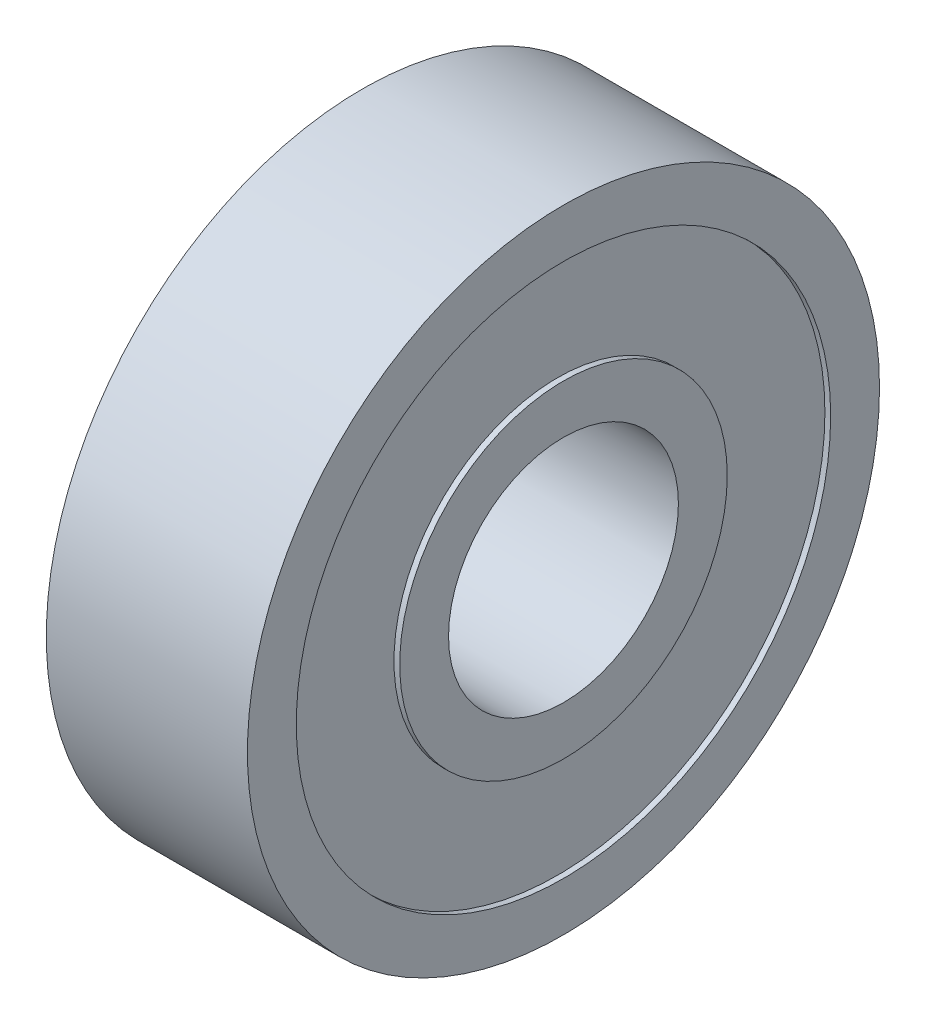
ISO-10303-21;
HEADER;
FILE_DESCRIPTION(('STEP AP214'),'2;1');
FILE_NAME('part.step','',(''),(''),'','','');
FILE_SCHEMA(('AUTOMOTIVE_DESIGN { 1 0 10303 214 1 1 1 1 }'));
ENDSEC;
DATA;
#1=APPLICATION_CONTEXT('core data for automotive mechanical design processes');
#2=APPLICATION_PROTOCOL_DEFINITION('international standard','automotive_design',2000,#1);
#3=PRODUCT_CONTEXT('',#1,'mechanical');
#4=PRODUCT('Part','Part','',(#3));
#5=PRODUCT_RELATED_PRODUCT_CATEGORY('part','',(#4));
#6=PRODUCT_DEFINITION_FORMATION('','',#4);
#7=PRODUCT_DEFINITION_CONTEXT('part definition',#1,'design');
#8=PRODUCT_DEFINITION('design','',#6,#7);
#9=PRODUCT_DEFINITION_SHAPE('','',#8);
#10=(LENGTH_UNIT() NAMED_UNIT(*) SI_UNIT(.MILLI.,.METRE.));
#11=(NAMED_UNIT(*) PLANE_ANGLE_UNIT() SI_UNIT($,.RADIAN.));
#12=(NAMED_UNIT(*) SI_UNIT($,.STERADIAN.) SOLID_ANGLE_UNIT());
#13=UNCERTAINTY_MEASURE_WITH_UNIT(LENGTH_MEASURE(1.E-05),#10,'distance_accuracy_value','');
#14=(GEOMETRIC_REPRESENTATION_CONTEXT(3) GLOBAL_UNCERTAINTY_ASSIGNED_CONTEXT((#13)) GLOBAL_UNIT_ASSIGNED_CONTEXT((#10,
#11,#12)) REPRESENTATION_CONTEXT('',''));
#15=CARTESIAN_POINT('',(0.,0.,0.));
#16=DIRECTION('',(0.,0.,1.));
#17=DIRECTION('',(1.,0.,0.));
#18=AXIS2_PLACEMENT_3D('',#15,#16,#17);
#19=CARTESIAN_POINT('',(-3.5,0.,0.));
#20=DIRECTION('',(1.,0.,0.));
#21=DIRECTION('',(0.,0.,-1.));
#22=AXIS2_PLACEMENT_3D('',#19,#20,#21);
#23=PLANE('',#22);
#24=CARTESIAN_POINT('',(-3.5,0.,0.));
#25=DIRECTION('',(1.,0.,0.));
#26=DIRECTION('',(0.,0.,-1.));
#27=AXIS2_PLACEMENT_3D('',#24,#25,#26);
#28=CIRCLE('',#27,4.);
#29=CARTESIAN_POINT('',(-3.5,0.,-4.));
#30=VERTEX_POINT('',#29);
#31=EDGE_CURVE('E43',#30,#30,#28,.T.);
#32=ORIENTED_EDGE('',*,*,#31,.T.);
#33=EDGE_LOOP('',(#32));
#34=FACE_BOUND('',#33,.T.);
#35=CARTESIAN_POINT('',(-3.5,0.,0.));
#36=DIRECTION('',(1.,0.,0.));
#37=DIRECTION('',(0.,0.,-1.));
#38=AXIS2_PLACEMENT_3D('',#35,#36,#37);
#39=CIRCLE('',#38,5.7);
#40=CARTESIAN_POINT('',(-3.5,0.,-5.7));
#41=VERTEX_POINT('',#40);
#42=EDGE_CURVE('E67',#41,#41,#39,.T.);
#43=ORIENTED_EDGE('',*,*,#42,.F.);
#44=EDGE_LOOP('',(#43));
#45=FACE_BOUND('',#44,.T.);
#46=ADVANCED_FACE('F30',(#34,#45),#23,.F.);
#47=CARTESIAN_POINT('',(3.5,0.,0.));
#48=DIRECTION('',(1.,0.,0.));
#49=DIRECTION('',(0.,0.,-1.));
#50=AXIS2_PLACEMENT_3D('',#47,#48,#49);
#51=PLANE('',#50);
#52=CARTESIAN_POINT('',(3.5,0.,0.));
#53=DIRECTION('',(1.,0.,0.));
#54=DIRECTION('',(0.,0.,-1.));
#55=AXIS2_PLACEMENT_3D('',#52,#53,#54);
#56=CIRCLE('',#55,4.);
#57=CARTESIAN_POINT('',(3.5,0.,-4.));
#58=VERTEX_POINT('',#57);
#59=EDGE_CURVE('E41',#58,#58,#56,.T.);
#60=ORIENTED_EDGE('',*,*,#59,.F.);
#61=EDGE_LOOP('',(#60));
#62=FACE_BOUND('',#61,.T.);
#63=CARTESIAN_POINT('',(3.5,0.,0.));
#64=DIRECTION('',(1.,0.,0.));
#65=DIRECTION('',(0.,0.,-1.));
#66=AXIS2_PLACEMENT_3D('',#63,#64,#65);
#67=CIRCLE('',#66,5.7);
#68=CARTESIAN_POINT('',(3.5,0.,-5.7));
#69=VERTEX_POINT('',#68);
#70=EDGE_CURVE('E55',#69,#69,#67,.T.);
#71=ORIENTED_EDGE('',*,*,#70,.T.);
#72=EDGE_LOOP('',(#71));
#73=FACE_BOUND('',#72,.T.);
#74=ADVANCED_FACE('F83',(#62,#73),#51,.T.);
#75=CARTESIAN_POINT('',(3.5,0.,0.));
#76=DIRECTION('',(1.,0.,0.));
#77=DIRECTION('',(0.,0.,-1.));
#78=AXIS2_PLACEMENT_3D('',#75,#76,#77);
#79=CIRCLE('',#78,9.3);
#80=CARTESIAN_POINT('',(3.5,0.,-9.3));
#81=VERTEX_POINT('',#80);
#82=EDGE_CURVE('E49',#81,#81,#79,.T.);
#83=ORIENTED_EDGE('',*,*,#82,.F.);
#84=EDGE_LOOP('',(#83));
#85=FACE_BOUND('',#84,.T.);
#86=CARTESIAN_POINT('',(3.5,0.,0.));
#87=DIRECTION('',(1.,0.,0.));
#88=DIRECTION('',(0.,0.,-1.));
#89=AXIS2_PLACEMENT_3D('',#86,#87,#88);
#90=CIRCLE('',#89,11.);
#91=CARTESIAN_POINT('',(3.5,0.,-11.));
#92=VERTEX_POINT('',#91);
#93=EDGE_CURVE('E10',#92,#92,#90,.T.);
#94=ORIENTED_EDGE('',*,*,#93,.T.);
#95=EDGE_LOOP('',(#94));
#96=FACE_BOUND('',#95,.T.);
#97=ADVANCED_FACE('F89',(#85,#96),#51,.T.);
#98=CARTESIAN_POINT('',(-3.5,0.,0.));
#99=DIRECTION('',(1.,0.,0.));
#100=DIRECTION('',(0.,0.,-1.));
#101=AXIS2_PLACEMENT_3D('',#98,#99,#100);
#102=CIRCLE('',#101,9.3);
#103=CARTESIAN_POINT('',(-3.5,0.,-9.3));
#104=VERTEX_POINT('',#103);
#105=EDGE_CURVE('E61',#104,#104,#102,.T.);
#106=ORIENTED_EDGE('',*,*,#105,.T.);
#107=EDGE_LOOP('',(#106));
#108=FACE_BOUND('',#107,.T.);
#109=CARTESIAN_POINT('',(-3.5,0.,0.));
#110=DIRECTION('',(1.,0.,0.));
#111=DIRECTION('',(0.,0.,-1.));
#112=AXIS2_PLACEMENT_3D('',#109,#110,#111);
#113=CIRCLE('',#112,11.);
#114=CARTESIAN_POINT('',(-3.5,0.,-11.));
#115=VERTEX_POINT('',#114);
#116=EDGE_CURVE('E34',#115,#115,#113,.T.);
#117=ORIENTED_EDGE('',*,*,#116,.F.);
#118=EDGE_LOOP('',(#117));
#119=FACE_BOUND('',#118,.T.);
#120=ADVANCED_FACE('F85',(#108,#119),#23,.F.);
#121=CARTESIAN_POINT('',(3.5,0.,0.));
#122=DIRECTION('',(-1.,0.,0.));
#123=DIRECTION('',(0.,0.,1.));
#124=AXIS2_PLACEMENT_3D('',#121,#122,#123);
#125=CYLINDRICAL_SURFACE('',#124,11.);
#126=ORIENTED_EDGE('',*,*,#93,.F.);
#127=EDGE_LOOP('',(#126));
#128=FACE_BOUND('',#127,.T.);
#129=ORIENTED_EDGE('',*,*,#116,.T.);
#130=EDGE_LOOP('',(#129));
#131=FACE_BOUND('',#130,.T.);
#132=ADVANCED_FACE('F32',(#128,#131),#125,.T.);
#133=CARTESIAN_POINT('',(3.5,0.,0.));
#134=DIRECTION('',(-1.,0.,0.));
#135=DIRECTION('',(0.,0.,1.));
#136=AXIS2_PLACEMENT_3D('',#133,#134,#135);
#137=CYLINDRICAL_SURFACE('',#136,4.);
#138=ORIENTED_EDGE('',*,*,#59,.T.);
#139=EDGE_LOOP('',(#138));
#140=FACE_BOUND('',#139,.T.);
#141=ORIENTED_EDGE('',*,*,#31,.F.);
#142=EDGE_LOOP('',(#141));
#143=FACE_BOUND('',#142,.T.);
#144=ADVANCED_FACE('F98',(#140,#143),#137,.F.);
#145=CARTESIAN_POINT('',(3.3,0.,0.));
#146=DIRECTION('',(1.,0.,0.));
#147=DIRECTION('',(0.,0.,-1.));
#148=AXIS2_PLACEMENT_3D('',#145,#146,#147);
#149=CYLINDRICAL_SURFACE('',#148,9.3);
#150=CARTESIAN_POINT('',(3.3,0.,0.));
#151=DIRECTION('',(1.,0.,0.));
#152=DIRECTION('',(0.,0.,-1.));
#153=AXIS2_PLACEMENT_3D('',#150,#151,#152);
#154=CIRCLE('',#153,9.3);
#155=CARTESIAN_POINT('',(3.3,0.,-9.3));
#156=VERTEX_POINT('',#155);
#157=EDGE_CURVE('E46',#156,#156,#154,.T.);
#158=ORIENTED_EDGE('',*,*,#157,.F.);
#159=EDGE_LOOP('',(#158));
#160=FACE_BOUND('',#159,.T.);
#161=ORIENTED_EDGE('',*,*,#82,.T.);
#162=EDGE_LOOP('',(#161));
#163=FACE_BOUND('',#162,.T.);
#164=ADVANCED_FACE('F122',(#160,#163),#149,.F.);
#165=CARTESIAN_POINT('',(3.3,0.,0.));
#166=DIRECTION('',(1.,0.,0.));
#167=DIRECTION('',(0.,0.,-1.));
#168=AXIS2_PLACEMENT_3D('',#165,#166,#167);
#169=PLANE('',#168);
#170=CARTESIAN_POINT('',(3.3,0.,0.));
#171=DIRECTION('',(1.,0.,0.));
#172=DIRECTION('',(0.,0.,-1.));
#173=AXIS2_PLACEMENT_3D('',#170,#171,#172);
#174=CIRCLE('',#173,5.7);
#175=CARTESIAN_POINT('',(3.3,0.,-5.7));
#176=VERTEX_POINT('',#175);
#177=EDGE_CURVE('E52',#176,#176,#174,.T.);
#178=ORIENTED_EDGE('',*,*,#177,.F.);
#179=EDGE_LOOP('',(#178));
#180=FACE_BOUND('',#179,.T.);
#181=ORIENTED_EDGE('',*,*,#157,.T.);
#182=EDGE_LOOP('',(#181));
#183=FACE_BOUND('',#182,.T.);
#184=ADVANCED_FACE('F118',(#180,#183),#169,.T.);
#185=CARTESIAN_POINT('',(3.3,0.,0.));
#186=DIRECTION('',(1.,0.,0.));
#187=DIRECTION('',(0.,0.,-1.));
#188=AXIS2_PLACEMENT_3D('',#185,#186,#187);
#189=CYLINDRICAL_SURFACE('',#188,5.7);
#190=ORIENTED_EDGE('',*,*,#177,.T.);
#191=EDGE_LOOP('',(#190));
#192=FACE_BOUND('',#191,.T.);
#193=ORIENTED_EDGE('',*,*,#70,.F.);
#194=EDGE_LOOP('',(#193));
#195=FACE_BOUND('',#194,.T.);
#196=ADVANCED_FACE('F112',(#192,#195),#189,.T.);
#197=CARTESIAN_POINT('',(-3.3,0.,0.));
#198=DIRECTION('',(-1.,0.,0.));
#199=DIRECTION('',(0.,0.,-1.));
#200=AXIS2_PLACEMENT_3D('',#197,#198,#199);
#201=PLANE('',#200);
#202=CARTESIAN_POINT('',(-3.3,0.,0.));
#203=DIRECTION('',(1.,0.,0.));
#204=DIRECTION('',(0.,0.,-1.));
#205=AXIS2_PLACEMENT_3D('',#202,#203,#204);
#206=CIRCLE('',#205,9.3);
#207=CARTESIAN_POINT('',(-3.3,0.,-9.3));
#208=VERTEX_POINT('',#207);
#209=EDGE_CURVE('E58',#208,#208,#206,.T.);
#210=ORIENTED_EDGE('',*,*,#209,.F.);
#211=EDGE_LOOP('',(#210));
#212=FACE_BOUND('',#211,.T.);
#213=CARTESIAN_POINT('',(-3.3,0.,0.));
#214=DIRECTION('',(1.,0.,0.));
#215=DIRECTION('',(0.,0.,-1.));
#216=AXIS2_PLACEMENT_3D('',#213,#214,#215);
#217=CIRCLE('',#216,5.7);
#218=CARTESIAN_POINT('',(-3.3,0.,-5.7));
#219=VERTEX_POINT('',#218);
#220=EDGE_CURVE('E64',#219,#219,#217,.T.);
#221=ORIENTED_EDGE('',*,*,#220,.T.);
#222=EDGE_LOOP('',(#221));
#223=FACE_BOUND('',#222,.T.);
#224=ADVANCED_FACE('F73',(#212,#223),#201,.T.);
#225=CARTESIAN_POINT('',(-3.3,0.,0.));
#226=DIRECTION('',(-1.,0.,0.));
#227=DIRECTION('',(0.,0.,1.));
#228=AXIS2_PLACEMENT_3D('',#225,#226,#227);
#229=CYLINDRICAL_SURFACE('',#228,9.3);
#230=ORIENTED_EDGE('',*,*,#209,.T.);
#231=EDGE_LOOP('',(#230));
#232=FACE_BOUND('',#231,.T.);
#233=ORIENTED_EDGE('',*,*,#105,.F.);
#234=EDGE_LOOP('',(#233));
#235=FACE_BOUND('',#234,.T.);
#236=ADVANCED_FACE('F78',(#232,#235),#229,.F.);
#237=CARTESIAN_POINT('',(-3.3,0.,0.));
#238=DIRECTION('',(-1.,0.,0.));
#239=DIRECTION('',(0.,0.,1.));
#240=AXIS2_PLACEMENT_3D('',#237,#238,#239);
#241=CYLINDRICAL_SURFACE('',#240,5.7);
#242=ORIENTED_EDGE('',*,*,#220,.F.);
#243=EDGE_LOOP('',(#242));
#244=FACE_BOUND('',#243,.T.);
#245=ORIENTED_EDGE('',*,*,#42,.T.);
#246=EDGE_LOOP('',(#245));
#247=FACE_BOUND('',#246,.T.);
#248=ADVANCED_FACE('F75',(#244,#247),#241,.T.);
#249=CLOSED_SHELL('',(#46,#74,#97,#120,#132,#144,#164,#184,#196,#224,#236,#248));
#250=MANIFOLD_SOLID_BREP('B2',#249);
#251=ADVANCED_BREP_SHAPE_REPRESENTATION('',(#18,#250),#14);
#252=SHAPE_DEFINITION_REPRESENTATION(#9,#251);
ENDSEC;
END-ISO-10303-21;
